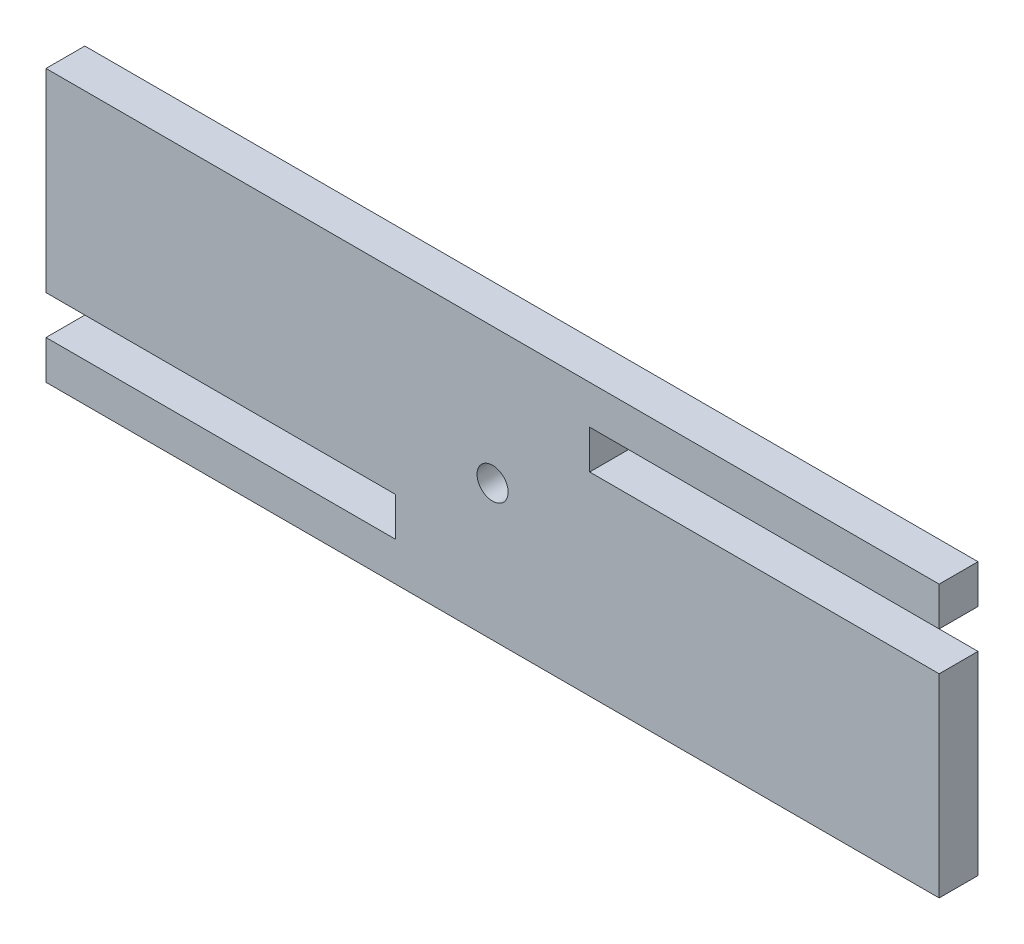
ISO-10303-21;
HEADER;
FILE_DESCRIPTION(('STEP AP214'),'2;1');
FILE_NAME('part.step','',(''),(''),'','','');
FILE_SCHEMA(('AUTOMOTIVE_DESIGN { 1 0 10303 214 1 1 1 1 }'));
ENDSEC;
DATA;
#1=APPLICATION_CONTEXT('core data for automotive mechanical design processes');
#2=APPLICATION_PROTOCOL_DEFINITION('international standard','automotive_design',2000,#1);
#3=PRODUCT_CONTEXT('',#1,'mechanical');
#4=PRODUCT('Part','Part','',(#3));
#5=PRODUCT_RELATED_PRODUCT_CATEGORY('part','',(#4));
#6=PRODUCT_DEFINITION_FORMATION('','',#4);
#7=PRODUCT_DEFINITION_CONTEXT('part definition',#1,'design');
#8=PRODUCT_DEFINITION('design','',#6,#7);
#9=PRODUCT_DEFINITION_SHAPE('','',#8);
#10=(LENGTH_UNIT() NAMED_UNIT(*) SI_UNIT(.MILLI.,.METRE.));
#11=(NAMED_UNIT(*) PLANE_ANGLE_UNIT() SI_UNIT($,.RADIAN.));
#12=(NAMED_UNIT(*) SI_UNIT($,.STERADIAN.) SOLID_ANGLE_UNIT());
#13=UNCERTAINTY_MEASURE_WITH_UNIT(LENGTH_MEASURE(1.E-05),#10,'distance_accuracy_value','');
#14=(GEOMETRIC_REPRESENTATION_CONTEXT(3) GLOBAL_UNCERTAINTY_ASSIGNED_CONTEXT((#13)) GLOBAL_UNIT_ASSIGNED_CONTEXT((#10,
#11,#12)) REPRESENTATION_CONTEXT('',''));
#15=CARTESIAN_POINT('',(0.,0.,0.));
#16=DIRECTION('',(0.,0.,1.));
#17=DIRECTION('',(1.,0.,0.));
#18=AXIS2_PLACEMENT_3D('',#15,#16,#17);
#19=CARTESIAN_POINT('',(0.,0.,10.));
#20=DIRECTION('',(0.,0.,-1.));
#21=DIRECTION('',(-1.,0.,0.));
#22=AXIS2_PLACEMENT_3D('',#19,#20,#21);
#23=PLANE('',#22);
#24=DIRECTION('',(0.,-1.,0.));
#25=VECTOR('',#24,1.);
#26=CARTESIAN_POINT('',(-115.,-15.,10.));
#27=LINE('',#26,#25);
#28=CARTESIAN_POINT('',(-115.,35.,10.));
#29=VERTEX_POINT('',#28);
#30=CARTESIAN_POINT('',(-115.,-15.,10.));
#31=VERTEX_POINT('',#30);
#32=EDGE_CURVE('E200',#29,#31,#27,.T.);
#33=ORIENTED_EDGE('',*,*,#32,.T.);
#34=DIRECTION('',(1.,0.,0.));
#35=VECTOR('',#34,1.);
#36=CARTESIAN_POINT('',(-25.,-15.,10.));
#37=LINE('',#36,#35);
#38=CARTESIAN_POINT('',(-25.,-15.,10.));
#39=VERTEX_POINT('',#38);
#40=EDGE_CURVE('E112',#31,#39,#37,.T.);
#41=ORIENTED_EDGE('',*,*,#40,.T.);
#42=DIRECTION('',(0.,-1.,0.));
#43=VECTOR('',#42,1.);
#44=CARTESIAN_POINT('',(-25.,-25.,10.));
#45=LINE('',#44,#43);
#46=CARTESIAN_POINT('',(-25.,-25.,10.));
#47=VERTEX_POINT('',#46);
#48=EDGE_CURVE('E237',#39,#47,#45,.T.);
#49=ORIENTED_EDGE('',*,*,#48,.T.);
#50=DIRECTION('',(-1.,0.,0.));
#51=VECTOR('',#50,1.);
#52=CARTESIAN_POINT('',(-115.,-25.,10.));
#53=LINE('',#52,#51);
#54=CARTESIAN_POINT('',(-115.,-25.,10.));
#55=VERTEX_POINT('',#54);
#56=EDGE_CURVE('E257',#47,#55,#53,.T.);
#57=ORIENTED_EDGE('',*,*,#56,.T.);
#58=DIRECTION('',(0.,-1.,0.));
#59=VECTOR('',#58,1.);
#60=CARTESIAN_POINT('',(-115.,-35.,10.));
#61=LINE('',#60,#59);
#62=CARTESIAN_POINT('',(-115.,-35.,10.));
#63=VERTEX_POINT('',#62);
#64=EDGE_CURVE('E253',#55,#63,#61,.T.);
#65=ORIENTED_EDGE('',*,*,#64,.T.);
#66=DIRECTION('',(1.,0.,0.));
#67=VECTOR('',#66,1.);
#68=CARTESIAN_POINT('',(115.,-35.,10.));
#69=LINE('',#68,#67);
#70=CARTESIAN_POINT('',(115.,-35.,10.));
#71=VERTEX_POINT('',#70);
#72=EDGE_CURVE('E256',#63,#71,#69,.T.);
#73=ORIENTED_EDGE('',*,*,#72,.T.);
#74=DIRECTION('',(0.,1.,0.));
#75=VECTOR('',#74,1.);
#76=CARTESIAN_POINT('',(115.,15.,10.));
#77=LINE('',#76,#75);
#78=CARTESIAN_POINT('',(115.,15.,10.));
#79=VERTEX_POINT('',#78);
#80=EDGE_CURVE('E261',#71,#79,#77,.T.);
#81=ORIENTED_EDGE('',*,*,#80,.T.);
#82=DIRECTION('',(-1.,0.,0.));
#83=VECTOR('',#82,1.);
#84=CARTESIAN_POINT('',(25.,15.,10.));
#85=LINE('',#84,#83);
#86=CARTESIAN_POINT('',(25.,15.,10.));
#87=VERTEX_POINT('',#86);
#88=EDGE_CURVE('E268',#79,#87,#85,.T.);
#89=ORIENTED_EDGE('',*,*,#88,.T.);
#90=DIRECTION('',(0.,1.,0.));
#91=VECTOR('',#90,1.);
#92=CARTESIAN_POINT('',(25.,25.,10.));
#93=LINE('',#92,#91);
#94=CARTESIAN_POINT('',(25.,25.,10.));
#95=VERTEX_POINT('',#94);
#96=EDGE_CURVE('E143',#87,#95,#93,.T.);
#97=ORIENTED_EDGE('',*,*,#96,.T.);
#98=DIRECTION('',(1.,0.,0.));
#99=VECTOR('',#98,1.);
#100=CARTESIAN_POINT('',(115.,25.,10.));
#101=LINE('',#100,#99);
#102=CARTESIAN_POINT('',(115.,25.,10.));
#103=VERTEX_POINT('',#102);
#104=EDGE_CURVE('E137',#95,#103,#101,.T.);
#105=ORIENTED_EDGE('',*,*,#104,.T.);
#106=DIRECTION('',(0.,1.,0.));
#107=VECTOR('',#106,1.);
#108=CARTESIAN_POINT('',(115.,35.,10.));
#109=LINE('',#108,#107);
#110=CARTESIAN_POINT('',(115.,35.,10.));
#111=VERTEX_POINT('',#110);
#112=EDGE_CURVE('E141',#103,#111,#109,.T.);
#113=ORIENTED_EDGE('',*,*,#112,.T.);
#114=DIRECTION('',(-1.,0.,0.));
#115=VECTOR('',#114,1.);
#116=CARTESIAN_POINT('',(-115.,35.,10.));
#117=LINE('',#116,#115);
#118=EDGE_CURVE('E57',#111,#29,#117,.T.);
#119=ORIENTED_EDGE('',*,*,#118,.T.);
#120=EDGE_LOOP('',(#33,#41,#49,#57,#65,#73,#81,#89,#97,#105,#113,#119));
#121=FACE_BOUND('',#120,.T.);
#122=CARTESIAN_POINT('',(0.,0.,10.));
#123=DIRECTION('',(0.,0.,1.));
#124=DIRECTION('',(1.,0.,0.));
#125=AXIS2_PLACEMENT_3D('',#122,#123,#124);
#126=CIRCLE('',#125,4.);
#127=CARTESIAN_POINT('',(4.,0.,10.));
#128=VERTEX_POINT('',#127);
#129=EDGE_CURVE('E170',#128,#128,#126,.T.);
#130=ORIENTED_EDGE('',*,*,#129,.F.);
#131=EDGE_LOOP('',(#130));
#132=FACE_BOUND('',#131,.T.);
#133=ADVANCED_FACE('F39',(#121,#132),#23,.F.);
#134=CARTESIAN_POINT('',(0.,0.,0.));
#135=DIRECTION('',(0.,0.,-1.));
#136=DIRECTION('',(-1.,0.,0.));
#137=AXIS2_PLACEMENT_3D('',#134,#135,#136);
#138=PLANE('',#137);
#139=DIRECTION('',(0.,-1.,0.));
#140=VECTOR('',#139,1.);
#141=CARTESIAN_POINT('',(-115.,-15.,0.));
#142=LINE('',#141,#140);
#143=CARTESIAN_POINT('',(-115.,35.,0.));
#144=VERTEX_POINT('',#143);
#145=CARTESIAN_POINT('',(-115.,-15.,0.));
#146=VERTEX_POINT('',#145);
#147=EDGE_CURVE('E165',#144,#146,#142,.T.);
#148=ORIENTED_EDGE('',*,*,#147,.F.);
#149=DIRECTION('',(-1.,0.,0.));
#150=VECTOR('',#149,1.);
#151=CARTESIAN_POINT('',(-115.,35.,0.));
#152=LINE('',#151,#150);
#153=CARTESIAN_POINT('',(115.,35.,0.));
#154=VERTEX_POINT('',#153);
#155=EDGE_CURVE('E104',#154,#144,#152,.T.);
#156=ORIENTED_EDGE('',*,*,#155,.F.);
#157=DIRECTION('',(0.,1.,0.));
#158=VECTOR('',#157,1.);
#159=CARTESIAN_POINT('',(115.,35.,0.));
#160=LINE('',#159,#158);
#161=CARTESIAN_POINT('',(115.,25.,0.));
#162=VERTEX_POINT('',#161);
#163=EDGE_CURVE('E98',#162,#154,#160,.T.);
#164=ORIENTED_EDGE('',*,*,#163,.F.);
#165=DIRECTION('',(1.,0.,0.));
#166=VECTOR('',#165,1.);
#167=CARTESIAN_POINT('',(115.,25.,0.));
#168=LINE('',#167,#166);
#169=CARTESIAN_POINT('',(25.,25.,0.));
#170=VERTEX_POINT('',#169);
#171=EDGE_CURVE('E152',#170,#162,#168,.T.);
#172=ORIENTED_EDGE('',*,*,#171,.F.);
#173=DIRECTION('',(0.,1.,0.));
#174=VECTOR('',#173,1.);
#175=CARTESIAN_POINT('',(25.,25.,0.));
#176=LINE('',#175,#174);
#177=CARTESIAN_POINT('',(25.,15.,0.));
#178=VERTEX_POINT('',#177);
#179=EDGE_CURVE('E191',#178,#170,#176,.T.);
#180=ORIENTED_EDGE('',*,*,#179,.F.);
#181=DIRECTION('',(-1.,0.,0.));
#182=VECTOR('',#181,1.);
#183=CARTESIAN_POINT('',(25.,15.,0.));
#184=LINE('',#183,#182);
#185=CARTESIAN_POINT('',(115.,15.,0.));
#186=VERTEX_POINT('',#185);
#187=EDGE_CURVE('E188',#186,#178,#184,.T.);
#188=ORIENTED_EDGE('',*,*,#187,.F.);
#189=DIRECTION('',(0.,1.,0.));
#190=VECTOR('',#189,1.);
#191=CARTESIAN_POINT('',(115.,15.,0.));
#192=LINE('',#191,#190);
#193=CARTESIAN_POINT('',(115.,-35.,0.));
#194=VERTEX_POINT('',#193);
#195=EDGE_CURVE('E185',#194,#186,#192,.T.);
#196=ORIENTED_EDGE('',*,*,#195,.F.);
#197=DIRECTION('',(1.,0.,0.));
#198=VECTOR('',#197,1.);
#199=CARTESIAN_POINT('',(115.,-35.,0.));
#200=LINE('',#199,#198);
#201=CARTESIAN_POINT('',(-115.,-35.,0.));
#202=VERTEX_POINT('',#201);
#203=EDGE_CURVE('E182',#202,#194,#200,.T.);
#204=ORIENTED_EDGE('',*,*,#203,.F.);
#205=DIRECTION('',(0.,-1.,0.));
#206=VECTOR('',#205,1.);
#207=CARTESIAN_POINT('',(-115.,-35.,0.));
#208=LINE('',#207,#206);
#209=CARTESIAN_POINT('',(-115.,-25.,0.));
#210=VERTEX_POINT('',#209);
#211=EDGE_CURVE('E179',#210,#202,#208,.T.);
#212=ORIENTED_EDGE('',*,*,#211,.F.);
#213=DIRECTION('',(-1.,0.,0.));
#214=VECTOR('',#213,1.);
#215=CARTESIAN_POINT('',(-115.,-25.,0.));
#216=LINE('',#215,#214);
#217=CARTESIAN_POINT('',(-25.,-25.,0.));
#218=VERTEX_POINT('',#217);
#219=EDGE_CURVE('E176',#218,#210,#216,.T.);
#220=ORIENTED_EDGE('',*,*,#219,.F.);
#221=DIRECTION('',(0.,-1.,0.));
#222=VECTOR('',#221,1.);
#223=CARTESIAN_POINT('',(-25.,-25.,0.));
#224=LINE('',#223,#222);
#225=CARTESIAN_POINT('',(-25.,-15.,0.));
#226=VERTEX_POINT('',#225);
#227=EDGE_CURVE('E173',#226,#218,#224,.T.);
#228=ORIENTED_EDGE('',*,*,#227,.F.);
#229=DIRECTION('',(1.,0.,0.));
#230=VECTOR('',#229,1.);
#231=CARTESIAN_POINT('',(-25.,-15.,0.));
#232=LINE('',#231,#230);
#233=EDGE_CURVE('E169',#146,#226,#232,.T.);
#234=ORIENTED_EDGE('',*,*,#233,.F.);
#235=EDGE_LOOP('',(#148,#156,#164,#172,#180,#188,#196,#204,#212,#220,#228,#234));
#236=FACE_BOUND('',#235,.T.);
#237=CARTESIAN_POINT('',(0.,0.,0.));
#238=DIRECTION('',(0.,0.,1.));
#239=DIRECTION('',(1.,0.,0.));
#240=AXIS2_PLACEMENT_3D('',#237,#238,#239);
#241=CIRCLE('',#240,4.);
#242=CARTESIAN_POINT('',(4.,0.,0.));
#243=VERTEX_POINT('',#242);
#244=EDGE_CURVE('E417',#243,#243,#241,.T.);
#245=ORIENTED_EDGE('',*,*,#244,.T.);
#246=EDGE_LOOP('',(#245));
#247=FACE_BOUND('',#246,.T.);
#248=ADVANCED_FACE('F241',(#236,#247),#138,.T.);
#249=CARTESIAN_POINT('',(-115.,-15.,10.));
#250=DIRECTION('',(1.,0.,0.));
#251=DIRECTION('',(0.,0.,-1.));
#252=AXIS2_PLACEMENT_3D('',#249,#250,#251);
#253=PLANE('',#252);
#254=ORIENTED_EDGE('',*,*,#147,.T.);
#255=DIRECTION('',(0.,0.,-1.));
#256=VECTOR('',#255,1.);
#257=CARTESIAN_POINT('',(-115.,-15.,10.));
#258=LINE('',#257,#256);
#259=EDGE_CURVE('E11',#31,#146,#258,.T.);
#260=ORIENTED_EDGE('',*,*,#259,.F.);
#261=ORIENTED_EDGE('',*,*,#32,.F.);
#262=DIRECTION('',(0.,0.,-1.));
#263=VECTOR('',#262,1.);
#264=CARTESIAN_POINT('',(-115.,35.,10.));
#265=LINE('',#264,#263);
#266=EDGE_CURVE('E161',#29,#144,#265,.T.);
#267=ORIENTED_EDGE('',*,*,#266,.T.);
#268=EDGE_LOOP('',(#254,#260,#261,#267));
#269=FACE_BOUND('',#268,.T.);
#270=ADVANCED_FACE('F41',(#269),#253,.F.);
#271=CARTESIAN_POINT('',(-25.,-15.,10.));
#272=DIRECTION('',(0.,1.,0.));
#273=DIRECTION('',(-1.,0.,0.));
#274=AXIS2_PLACEMENT_3D('',#271,#272,#273);
#275=PLANE('',#274);
#276=ORIENTED_EDGE('',*,*,#233,.T.);
#277=DIRECTION('',(0.,0.,-1.));
#278=VECTOR('',#277,1.);
#279=CARTESIAN_POINT('',(-25.,-15.,10.));
#280=LINE('',#279,#278);
#281=EDGE_CURVE('E49',#39,#226,#280,.T.);
#282=ORIENTED_EDGE('',*,*,#281,.F.);
#283=ORIENTED_EDGE('',*,*,#40,.F.);
#284=ORIENTED_EDGE('',*,*,#259,.T.);
#285=EDGE_LOOP('',(#276,#282,#283,#284));
#286=FACE_BOUND('',#285,.T.);
#287=ADVANCED_FACE('F304',(#286),#275,.F.);
#288=CARTESIAN_POINT('',(-25.,-25.,10.));
#289=DIRECTION('',(1.,0.,0.));
#290=DIRECTION('',(0.,0.,-1.));
#291=AXIS2_PLACEMENT_3D('',#288,#289,#290);
#292=PLANE('',#291);
#293=ORIENTED_EDGE('',*,*,#227,.T.);
#294=DIRECTION('',(0.,0.,-1.));
#295=VECTOR('',#294,1.);
#296=CARTESIAN_POINT('',(-25.,-25.,10.));
#297=LINE('',#296,#295);
#298=EDGE_CURVE('E227',#47,#218,#297,.T.);
#299=ORIENTED_EDGE('',*,*,#298,.F.);
#300=ORIENTED_EDGE('',*,*,#48,.F.);
#301=ORIENTED_EDGE('',*,*,#281,.T.);
#302=EDGE_LOOP('',(#293,#299,#300,#301));
#303=FACE_BOUND('',#302,.T.);
#304=ADVANCED_FACE('F235',(#303),#292,.F.);
#305=CARTESIAN_POINT('',(-115.,-25.,10.));
#306=DIRECTION('',(0.,-1.,0.));
#307=DIRECTION('',(0.,0.,-1.));
#308=AXIS2_PLACEMENT_3D('',#305,#306,#307);
#309=PLANE('',#308);
#310=ORIENTED_EDGE('',*,*,#219,.T.);
#311=DIRECTION('',(0.,0.,-1.));
#312=VECTOR('',#311,1.);
#313=CARTESIAN_POINT('',(-115.,-25.,10.));
#314=LINE('',#313,#312);
#315=EDGE_CURVE('E223',#55,#210,#314,.T.);
#316=ORIENTED_EDGE('',*,*,#315,.F.);
#317=ORIENTED_EDGE('',*,*,#56,.F.);
#318=ORIENTED_EDGE('',*,*,#298,.T.);
#319=EDGE_LOOP('',(#310,#316,#317,#318));
#320=FACE_BOUND('',#319,.T.);
#321=ADVANCED_FACE('F247',(#320),#309,.F.);
#322=CARTESIAN_POINT('',(-115.,-35.,10.));
#323=DIRECTION('',(1.,0.,0.));
#324=DIRECTION('',(0.,1.,0.));
#325=AXIS2_PLACEMENT_3D('',#322,#323,#324);
#326=PLANE('',#325);
#327=ORIENTED_EDGE('',*,*,#211,.T.);
#328=DIRECTION('',(0.,0.,-1.));
#329=VECTOR('',#328,1.);
#330=CARTESIAN_POINT('',(-115.,-35.,10.));
#331=LINE('',#330,#329);
#332=EDGE_CURVE('E219',#63,#202,#331,.T.);
#333=ORIENTED_EDGE('',*,*,#332,.F.);
#334=ORIENTED_EDGE('',*,*,#64,.F.);
#335=ORIENTED_EDGE('',*,*,#315,.T.);
#336=EDGE_LOOP('',(#327,#333,#334,#335));
#337=FACE_BOUND('',#336,.T.);
#338=ADVANCED_FACE('F251',(#337),#326,.F.);
#339=CARTESIAN_POINT('',(115.,-35.,10.));
#340=DIRECTION('',(0.,1.,0.));
#341=DIRECTION('',(-1.,0.,0.));
#342=AXIS2_PLACEMENT_3D('',#339,#340,#341);
#343=PLANE('',#342);
#344=ORIENTED_EDGE('',*,*,#203,.T.);
#345=DIRECTION('',(0.,0.,-1.));
#346=VECTOR('',#345,1.);
#347=CARTESIAN_POINT('',(115.,-35.,10.));
#348=LINE('',#347,#346);
#349=EDGE_CURVE('E215',#71,#194,#348,.T.);
#350=ORIENTED_EDGE('',*,*,#349,.F.);
#351=ORIENTED_EDGE('',*,*,#72,.F.);
#352=ORIENTED_EDGE('',*,*,#332,.T.);
#353=EDGE_LOOP('',(#344,#350,#351,#352));
#354=FACE_BOUND('',#353,.T.);
#355=ADVANCED_FACE('F317',(#354),#343,.F.);
#356=CARTESIAN_POINT('',(115.,15.,10.));
#357=DIRECTION('',(-1.,0.,0.));
#358=DIRECTION('',(0.,-1.,0.));
#359=AXIS2_PLACEMENT_3D('',#356,#357,#358);
#360=PLANE('',#359);
#361=ORIENTED_EDGE('',*,*,#195,.T.);
#362=DIRECTION('',(0.,0.,-1.));
#363=VECTOR('',#362,1.);
#364=CARTESIAN_POINT('',(115.,15.,10.));
#365=LINE('',#364,#363);
#366=EDGE_CURVE('E211',#79,#186,#365,.T.);
#367=ORIENTED_EDGE('',*,*,#366,.F.);
#368=ORIENTED_EDGE('',*,*,#80,.F.);
#369=ORIENTED_EDGE('',*,*,#349,.T.);
#370=EDGE_LOOP('',(#361,#367,#368,#369));
#371=FACE_BOUND('',#370,.T.);
#372=ADVANCED_FACE('F320',(#371),#360,.F.);
#373=CARTESIAN_POINT('',(25.,15.,10.));
#374=DIRECTION('',(0.,-1.,0.));
#375=DIRECTION('',(0.,0.,-1.));
#376=AXIS2_PLACEMENT_3D('',#373,#374,#375);
#377=PLANE('',#376);
#378=ORIENTED_EDGE('',*,*,#187,.T.);
#379=DIRECTION('',(0.,0.,-1.));
#380=VECTOR('',#379,1.);
#381=CARTESIAN_POINT('',(25.,15.,10.));
#382=LINE('',#381,#380);
#383=EDGE_CURVE('E207',#87,#178,#382,.T.);
#384=ORIENTED_EDGE('',*,*,#383,.F.);
#385=ORIENTED_EDGE('',*,*,#88,.F.);
#386=ORIENTED_EDGE('',*,*,#366,.T.);
#387=EDGE_LOOP('',(#378,#384,#385,#386));
#388=FACE_BOUND('',#387,.T.);
#389=ADVANCED_FACE('F276',(#388),#377,.F.);
#390=CARTESIAN_POINT('',(25.,25.,10.));
#391=DIRECTION('',(-1.,0.,0.));
#392=DIRECTION('',(0.,-1.,0.));
#393=AXIS2_PLACEMENT_3D('',#390,#391,#392);
#394=PLANE('',#393);
#395=ORIENTED_EDGE('',*,*,#179,.T.);
#396=DIRECTION('',(0.,0.,-1.));
#397=VECTOR('',#396,1.);
#398=CARTESIAN_POINT('',(25.,25.,10.));
#399=LINE('',#398,#397);
#400=EDGE_CURVE('E154',#95,#170,#399,.T.);
#401=ORIENTED_EDGE('',*,*,#400,.F.);
#402=ORIENTED_EDGE('',*,*,#96,.F.);
#403=ORIENTED_EDGE('',*,*,#383,.T.);
#404=EDGE_LOOP('',(#395,#401,#402,#403));
#405=FACE_BOUND('',#404,.T.);
#406=ADVANCED_FACE('F280',(#405),#394,.F.);
#407=CARTESIAN_POINT('',(115.,25.,10.));
#408=DIRECTION('',(0.,1.,0.));
#409=DIRECTION('',(-1.,0.,0.));
#410=AXIS2_PLACEMENT_3D('',#407,#408,#409);
#411=PLANE('',#410);
#412=ORIENTED_EDGE('',*,*,#171,.T.);
#413=DIRECTION('',(0.,0.,-1.));
#414=VECTOR('',#413,1.);
#415=CARTESIAN_POINT('',(115.,25.,10.));
#416=LINE('',#415,#414);
#417=EDGE_CURVE('E149',#103,#162,#416,.T.);
#418=ORIENTED_EDGE('',*,*,#417,.F.);
#419=ORIENTED_EDGE('',*,*,#104,.F.);
#420=ORIENTED_EDGE('',*,*,#400,.T.);
#421=EDGE_LOOP('',(#412,#418,#419,#420));
#422=FACE_BOUND('',#421,.T.);
#423=ADVANCED_FACE('F150',(#422),#411,.F.);
#424=CARTESIAN_POINT('',(115.,35.,10.));
#425=DIRECTION('',(-1.,0.,0.));
#426=DIRECTION('',(0.,-1.,0.));
#427=AXIS2_PLACEMENT_3D('',#424,#425,#426);
#428=PLANE('',#427);
#429=ORIENTED_EDGE('',*,*,#163,.T.);
#430=DIRECTION('',(0.,0.,-1.));
#431=VECTOR('',#430,1.);
#432=CARTESIAN_POINT('',(115.,35.,10.));
#433=LINE('',#432,#431);
#434=EDGE_CURVE('E155',#111,#154,#433,.T.);
#435=ORIENTED_EDGE('',*,*,#434,.F.);
#436=ORIENTED_EDGE('',*,*,#112,.F.);
#437=ORIENTED_EDGE('',*,*,#417,.T.);
#438=EDGE_LOOP('',(#429,#435,#436,#437));
#439=FACE_BOUND('',#438,.T.);
#440=ADVANCED_FACE('F157',(#439),#428,.F.);
#441=CARTESIAN_POINT('',(-115.,35.,10.));
#442=DIRECTION('',(0.,-1.,0.));
#443=DIRECTION('',(1.,0.,0.));
#444=AXIS2_PLACEMENT_3D('',#441,#442,#443);
#445=PLANE('',#444);
#446=ORIENTED_EDGE('',*,*,#155,.T.);
#447=ORIENTED_EDGE('',*,*,#266,.F.);
#448=ORIENTED_EDGE('',*,*,#118,.F.);
#449=ORIENTED_EDGE('',*,*,#434,.T.);
#450=EDGE_LOOP('',(#446,#447,#448,#449));
#451=FACE_BOUND('',#450,.T.);
#452=ADVANCED_FACE('F284',(#451),#445,.F.);
#453=CARTESIAN_POINT('',(0.,0.,10.));
#454=DIRECTION('',(0.,0.,-1.));
#455=DIRECTION('',(-1.,0.,0.));
#456=AXIS2_PLACEMENT_3D('',#453,#454,#455);
#457=CYLINDRICAL_SURFACE('',#456,4.);
#458=ORIENTED_EDGE('',*,*,#129,.T.);
#459=EDGE_LOOP('',(#458));
#460=FACE_BOUND('',#459,.T.);
#461=ORIENTED_EDGE('',*,*,#244,.F.);
#462=EDGE_LOOP('',(#461));
#463=FACE_BOUND('',#462,.T.);
#464=ADVANCED_FACE('F286',(#460,#463),#457,.F.);
#465=CLOSED_SHELL('',(#133,#248,#270,#287,#304,#321,#338,#355,#372,#389,#406,#423,#440,#452,#464));
#466=MANIFOLD_SOLID_BREP('B2',#465);
#467=ADVANCED_BREP_SHAPE_REPRESENTATION('',(#18,#466),#14);
#468=SHAPE_DEFINITION_REPRESENTATION(#9,#467);
ENDSEC;
END-ISO-10303-21;
